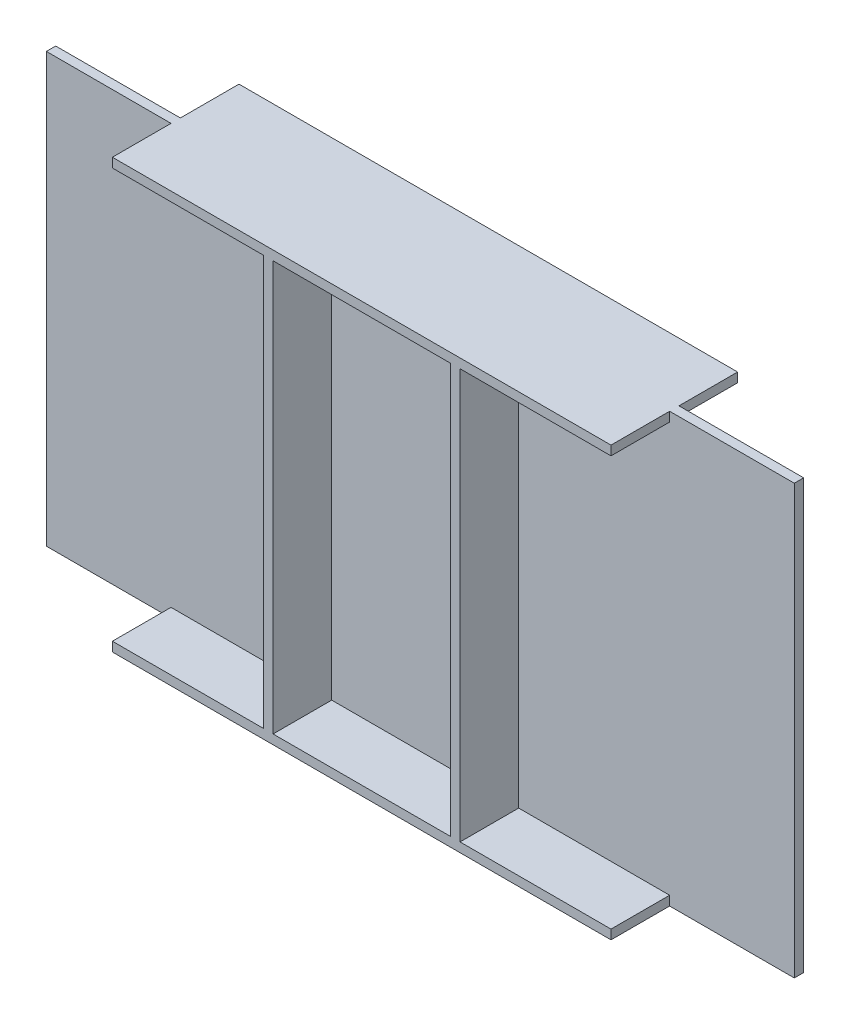
ISO-10303-21;
HEADER;
FILE_DESCRIPTION(('STEP AP214'),'2;1');
FILE_NAME('part.step','',(''),(''),'','','');
FILE_SCHEMA(('AUTOMOTIVE_DESIGN { 1 0 10303 214 1 1 1 1 }'));
ENDSEC;
DATA;
#1=APPLICATION_CONTEXT('core data for automotive mechanical design processes');
#2=APPLICATION_PROTOCOL_DEFINITION('international standard','automotive_design',2000,#1);
#3=PRODUCT_CONTEXT('',#1,'mechanical');
#4=PRODUCT('Part','Part','',(#3));
#5=PRODUCT_RELATED_PRODUCT_CATEGORY('part','',(#4));
#6=PRODUCT_DEFINITION_FORMATION('','',#4);
#7=PRODUCT_DEFINITION_CONTEXT('part definition',#1,'design');
#8=PRODUCT_DEFINITION('design','',#6,#7);
#9=PRODUCT_DEFINITION_SHAPE('','',#8);
#10=(LENGTH_UNIT() NAMED_UNIT(*) SI_UNIT(.MILLI.,.METRE.));
#11=(NAMED_UNIT(*) PLANE_ANGLE_UNIT() SI_UNIT($,.RADIAN.));
#12=(NAMED_UNIT(*) SI_UNIT($,.STERADIAN.) SOLID_ANGLE_UNIT());
#13=UNCERTAINTY_MEASURE_WITH_UNIT(LENGTH_MEASURE(1.E-05),#10,'distance_accuracy_value','');
#14=(GEOMETRIC_REPRESENTATION_CONTEXT(3) GLOBAL_UNCERTAINTY_ASSIGNED_CONTEXT((#13)) GLOBAL_UNIT_ASSIGNED_CONTEXT((#10,
#11,#12)) REPRESENTATION_CONTEXT('',''));
#15=CARTESIAN_POINT('',(0.,0.,0.));
#16=DIRECTION('',(0.,0.,1.));
#17=DIRECTION('',(1.,0.,0.));
#18=AXIS2_PLACEMENT_3D('',#15,#16,#17);
#19=CARTESIAN_POINT('',(0.,0.,12.));
#20=DIRECTION('',(0.,0.,-1.));
#21=DIRECTION('',(-1.,0.,0.));
#22=AXIS2_PLACEMENT_3D('',#19,#20,#21);
#23=PLANE('',#22);
#24=DIRECTION('',(1.,0.,0.));
#25=VECTOR('',#24,1.);
#26=CARTESIAN_POINT('',(0.,538.,12.));
#27=LINE('',#26,#25);
#28=CARTESIAN_POINT('',(366.25,538.,12.));
#29=VERTEX_POINT('',#28);
#30=CARTESIAN_POINT('',(593.75,538.,12.));
#31=VERTEX_POINT('',#30);
#32=EDGE_CURVE('E378',#29,#31,#27,.T.);
#33=ORIENTED_EDGE('',*,*,#32,.F.);
#34=DIRECTION('',(0.,-1.,0.));
#35=VECTOR('',#34,1.);
#36=CARTESIAN_POINT('',(366.25,0.,12.));
#37=LINE('',#36,#35);
#38=CARTESIAN_POINT('',(366.25,12.,12.));
#39=VERTEX_POINT('',#38);
#40=EDGE_CURVE('E545',#29,#39,#37,.T.);
#41=ORIENTED_EDGE('',*,*,#40,.T.);
#42=DIRECTION('',(-1.,0.,0.));
#43=VECTOR('',#42,1.);
#44=CARTESIAN_POINT('',(0.,12.,12.));
#45=LINE('',#44,#43);
#46=CARTESIAN_POINT('',(593.75,12.,12.));
#47=VERTEX_POINT('',#46);
#48=EDGE_CURVE('E283',#47,#39,#45,.T.);
#49=ORIENTED_EDGE('',*,*,#48,.F.);
#50=DIRECTION('',(0.,1.,0.));
#51=VECTOR('',#50,1.);
#52=CARTESIAN_POINT('',(593.75,-1.25322228302507E-13,12.));
#53=LINE('',#52,#51);
#54=EDGE_CURVE('E519',#47,#31,#53,.T.);
#55=ORIENTED_EDGE('',*,*,#54,.T.);
#56=EDGE_LOOP('',(#33,#41,#49,#55));
#57=FACE_BOUND('',#56,.T.);
#58=ADVANCED_FACE('F32',(#57),#23,.F.);
#59=CARTESIAN_POINT('',(0.,0.,0.));
#60=DIRECTION('',(0.,0.,-1.));
#61=DIRECTION('',(-1.,0.,0.));
#62=AXIS2_PLACEMENT_3D('',#59,#60,#61);
#63=PLANE('',#62);
#64=DIRECTION('',(0.,-1.,0.));
#65=VECTOR('',#64,1.);
#66=CARTESIAN_POINT('',(366.25,0.,0.));
#67=LINE('',#66,#65);
#68=CARTESIAN_POINT('',(366.25,538.,0.));
#69=VERTEX_POINT('',#68);
#70=CARTESIAN_POINT('',(366.25,12.,0.));
#71=VERTEX_POINT('',#70);
#72=EDGE_CURVE('E549',#69,#71,#67,.T.);
#73=ORIENTED_EDGE('',*,*,#72,.F.);
#74=DIRECTION('',(1.,0.,0.));
#75=VECTOR('',#74,1.);
#76=CARTESIAN_POINT('',(0.,538.,0.));
#77=LINE('',#76,#75);
#78=CARTESIAN_POINT('',(593.75,538.,0.));
#79=VERTEX_POINT('',#78);
#80=EDGE_CURVE('E425',#69,#79,#77,.T.);
#81=ORIENTED_EDGE('',*,*,#80,.T.);
#82=DIRECTION('',(0.,1.,0.));
#83=VECTOR('',#82,1.);
#84=CARTESIAN_POINT('',(593.75,-1.25322228302507E-13,0.));
#85=LINE('',#84,#83);
#86=CARTESIAN_POINT('',(593.75,12.,0.));
#87=VERTEX_POINT('',#86);
#88=EDGE_CURVE('E522',#87,#79,#85,.T.);
#89=ORIENTED_EDGE('',*,*,#88,.F.);
#90=DIRECTION('',(-1.,0.,0.));
#91=VECTOR('',#90,1.);
#92=CARTESIAN_POINT('',(0.,12.,0.));
#93=LINE('',#92,#91);
#94=EDGE_CURVE('E434',#87,#71,#93,.T.);
#95=ORIENTED_EDGE('',*,*,#94,.T.);
#96=EDGE_LOOP('',(#73,#81,#89,#95));
#97=FACE_BOUND('',#96,.T.);
#98=ADVANCED_FACE('F603',(#97),#63,.T.);
#99=CARTESIAN_POINT('',(0.,538.,0.));
#100=DIRECTION('',(0.,1.,0.));
#101=DIRECTION('',(0.,0.,1.));
#102=AXIS2_PLACEMENT_3D('',#99,#100,#101);
#103=PLANE('',#102);
#104=ORIENTED_EDGE('',*,*,#80,.F.);
#105=DIRECTION('',(0.,0.,-1.));
#106=VECTOR('',#105,1.);
#107=CARTESIAN_POINT('',(366.25,538.,87.25));
#108=LINE('',#107,#106);
#109=CARTESIAN_POINT('',(366.25,538.,-75.25));
#110=VERTEX_POINT('',#109);
#111=EDGE_CURVE('E562',#69,#110,#108,.T.);
#112=ORIENTED_EDGE('',*,*,#111,.T.);
#113=DIRECTION('',(-1.,0.,0.));
#114=VECTOR('',#113,1.);
#115=CARTESIAN_POINT('',(160.,538.,-75.25));
#116=LINE('',#115,#114);
#117=CARTESIAN_POINT('',(593.75,538.,-75.25));
#118=VERTEX_POINT('',#117);
#119=EDGE_CURVE('E351',#118,#110,#116,.T.);
#120=ORIENTED_EDGE('',*,*,#119,.F.);
#121=DIRECTION('',(0.,0.,-1.));
#122=VECTOR('',#121,1.);
#123=CARTESIAN_POINT('',(593.75,538.,87.25));
#124=LINE('',#123,#122);
#125=EDGE_CURVE('E532',#79,#118,#124,.T.);
#126=ORIENTED_EDGE('',*,*,#125,.F.);
#127=EDGE_LOOP('',(#104,#112,#120,#126));
#128=FACE_BOUND('',#127,.T.);
#129=ADVANCED_FACE('F587',(#128),#103,.F.);
#130=DIRECTION('',(1.,0.,0.));
#131=VECTOR('',#130,1.);
#132=CARTESIAN_POINT('',(160.,538.,87.25));
#133=LINE('',#132,#131);
#134=CARTESIAN_POINT('',(366.25,538.,87.25));
#135=VERTEX_POINT('',#134);
#136=CARTESIAN_POINT('',(593.75,538.,87.25));
#137=VERTEX_POINT('',#136);
#138=EDGE_CURVE('E342',#135,#137,#133,.T.);
#139=ORIENTED_EDGE('',*,*,#138,.F.);
#140=EDGE_CURVE('E270',#135,#29,#108,.T.);
#141=ORIENTED_EDGE('',*,*,#140,.T.);
#142=ORIENTED_EDGE('',*,*,#32,.T.);
#143=EDGE_CURVE('E533',#137,#31,#124,.T.);
#144=ORIENTED_EDGE('',*,*,#143,.F.);
#145=EDGE_LOOP('',(#139,#141,#142,#144));
#146=FACE_BOUND('',#145,.T.);
#147=ADVANCED_FACE('F626',(#146),#103,.F.);
#148=CARTESIAN_POINT('',(0.,12.,0.));
#149=DIRECTION('',(0.,-1.,0.));
#150=DIRECTION('',(0.,0.,-1.));
#151=AXIS2_PLACEMENT_3D('',#148,#149,#150);
#152=PLANE('',#151);
#153=DIRECTION('',(1.,0.,0.));
#154=VECTOR('',#153,1.);
#155=CARTESIAN_POINT('',(160.,12.,-75.25));
#156=LINE('',#155,#154);
#157=CARTESIAN_POINT('',(366.25,12.,-75.25));
#158=VERTEX_POINT('',#157);
#159=CARTESIAN_POINT('',(593.75,12.,-75.25));
#160=VERTEX_POINT('',#159);
#161=EDGE_CURVE('E510',#158,#160,#156,.T.);
#162=ORIENTED_EDGE('',*,*,#161,.F.);
#163=DIRECTION('',(0.,0.,-1.));
#164=VECTOR('',#163,1.);
#165=CARTESIAN_POINT('',(366.25,12.,87.25));
#166=LINE('',#165,#164);
#167=EDGE_CURVE('E285',#71,#158,#166,.T.);
#168=ORIENTED_EDGE('',*,*,#167,.F.);
#169=ORIENTED_EDGE('',*,*,#94,.F.);
#170=DIRECTION('',(0.,0.,-1.));
#171=VECTOR('',#170,1.);
#172=CARTESIAN_POINT('',(593.75,12.,87.25));
#173=LINE('',#172,#171);
#174=EDGE_CURVE('E528',#87,#160,#173,.T.);
#175=ORIENTED_EDGE('',*,*,#174,.T.);
#176=EDGE_LOOP('',(#162,#168,#169,#175));
#177=FACE_BOUND('',#176,.T.);
#178=ADVANCED_FACE('F578',(#177),#152,.F.);
#179=ORIENTED_EDGE('',*,*,#48,.T.);
#180=CARTESIAN_POINT('',(366.25,12.,87.25));
#181=VERTEX_POINT('',#180);
#182=EDGE_CURVE('E267',#181,#39,#166,.T.);
#183=ORIENTED_EDGE('',*,*,#182,.F.);
#184=DIRECTION('',(-1.,0.,0.));
#185=VECTOR('',#184,1.);
#186=CARTESIAN_POINT('',(160.,12.,87.25));
#187=LINE('',#186,#185);
#188=CARTESIAN_POINT('',(593.75,12.,87.25));
#189=VERTEX_POINT('',#188);
#190=EDGE_CURVE('E281',#189,#181,#187,.T.);
#191=ORIENTED_EDGE('',*,*,#190,.F.);
#192=EDGE_CURVE('E530',#189,#47,#173,.T.);
#193=ORIENTED_EDGE('',*,*,#192,.T.);
#194=EDGE_LOOP('',(#179,#183,#191,#193));
#195=FACE_BOUND('',#194,.T.);
#196=ADVANCED_FACE('F279',(#195),#152,.F.);
#197=CARTESIAN_POINT('',(606.25,538.,12.));
#198=VERTEX_POINT('',#197);
#199=CARTESIAN_POINT('',(800.,538.,12.));
#200=VERTEX_POINT('',#199);
#201=EDGE_CURVE('E366',#198,#200,#27,.T.);
#202=ORIENTED_EDGE('',*,*,#201,.F.);
#203=DIRECTION('',(0.,-1.,0.));
#204=VECTOR('',#203,1.);
#205=CARTESIAN_POINT('',(606.25,1.27960591003612E-13,12.));
#206=LINE('',#205,#204);
#207=CARTESIAN_POINT('',(606.25,12.,12.));
#208=VERTEX_POINT('',#207);
#209=EDGE_CURVE('E495',#198,#208,#206,.T.);
#210=ORIENTED_EDGE('',*,*,#209,.T.);
#211=CARTESIAN_POINT('',(800.,12.,12.));
#212=VERTEX_POINT('',#211);
#213=EDGE_CURVE('E324',#212,#208,#45,.T.);
#214=ORIENTED_EDGE('',*,*,#213,.F.);
#215=DIRECTION('',(0.,-1.,0.));
#216=VECTOR('',#215,1.);
#217=CARTESIAN_POINT('',(800.,0.,12.));
#218=LINE('',#217,#216);
#219=CARTESIAN_POINT('',(800.,0.,12.));
#220=VERTEX_POINT('',#219);
#221=EDGE_CURVE('E327',#212,#220,#218,.T.);
#222=ORIENTED_EDGE('',*,*,#221,.T.);
#223=DIRECTION('',(1.,0.,0.));
#224=VECTOR('',#223,1.);
#225=CARTESIAN_POINT('',(0.,0.,12.));
#226=LINE('',#225,#224);
#227=CARTESIAN_POINT('',(960.,0.,12.));
#228=VERTEX_POINT('',#227);
#229=EDGE_CURVE('E388',#220,#228,#226,.T.);
#230=ORIENTED_EDGE('',*,*,#229,.T.);
#231=DIRECTION('',(0.,1.,0.));
#232=VECTOR('',#231,1.);
#233=CARTESIAN_POINT('',(960.,0.,12.));
#234=LINE('',#233,#232);
#235=CARTESIAN_POINT('',(960.,550.,12.));
#236=VERTEX_POINT('',#235);
#237=EDGE_CURVE('E392',#228,#236,#234,.T.);
#238=ORIENTED_EDGE('',*,*,#237,.T.);
#239=DIRECTION('',(-1.,0.,0.));
#240=VECTOR('',#239,1.);
#241=CARTESIAN_POINT('',(0.,550.,12.));
#242=LINE('',#241,#240);
#243=CARTESIAN_POINT('',(800.,550.,12.));
#244=VERTEX_POINT('',#243);
#245=EDGE_CURVE('E395',#236,#244,#242,.T.);
#246=ORIENTED_EDGE('',*,*,#245,.T.);
#247=DIRECTION('',(0.,-1.,0.));
#248=VECTOR('',#247,1.);
#249=CARTESIAN_POINT('',(800.,0.,12.));
#250=LINE('',#249,#248);
#251=EDGE_CURVE('E377',#244,#200,#250,.T.);
#252=ORIENTED_EDGE('',*,*,#251,.T.);
#253=EDGE_LOOP('',(#202,#210,#214,#222,#230,#238,#246,#252));
#254=FACE_BOUND('',#253,.T.);
#255=ADVANCED_FACE('F459',(#254),#23,.F.);
#256=DIRECTION('',(0.,-1.,0.));
#257=VECTOR('',#256,1.);
#258=CARTESIAN_POINT('',(606.25,1.27960591003612E-13,0.));
#259=LINE('',#258,#257);
#260=CARTESIAN_POINT('',(606.25,538.,0.));
#261=VERTEX_POINT('',#260);
#262=CARTESIAN_POINT('',(606.25,12.,0.));
#263=VERTEX_POINT('',#262);
#264=EDGE_CURVE('E517',#261,#263,#259,.T.);
#265=ORIENTED_EDGE('',*,*,#264,.F.);
#266=CARTESIAN_POINT('',(800.,538.,0.));
#267=VERTEX_POINT('',#266);
#268=EDGE_CURVE('E420',#261,#267,#77,.T.);
#269=ORIENTED_EDGE('',*,*,#268,.T.);
#270=DIRECTION('',(0.,-1.,0.));
#271=VECTOR('',#270,1.);
#272=CARTESIAN_POINT('',(800.,0.,0.));
#273=LINE('',#272,#271);
#274=CARTESIAN_POINT('',(800.,550.,0.));
#275=VERTEX_POINT('',#274);
#276=EDGE_CURVE('E424',#275,#267,#273,.T.);
#277=ORIENTED_EDGE('',*,*,#276,.F.);
#278=DIRECTION('',(-1.,0.,0.));
#279=VECTOR('',#278,1.);
#280=CARTESIAN_POINT('',(0.,550.,0.));
#281=LINE('',#280,#279);
#282=CARTESIAN_POINT('',(960.,550.,0.));
#283=VERTEX_POINT('',#282);
#284=EDGE_CURVE('E389',#283,#275,#281,.T.);
#285=ORIENTED_EDGE('',*,*,#284,.F.);
#286=DIRECTION('',(0.,1.,0.));
#287=VECTOR('',#286,1.);
#288=CARTESIAN_POINT('',(960.,0.,0.));
#289=LINE('',#288,#287);
#290=CARTESIAN_POINT('',(960.,0.,0.));
#291=VERTEX_POINT('',#290);
#292=EDGE_CURVE('E404',#291,#283,#289,.T.);
#293=ORIENTED_EDGE('',*,*,#292,.F.);
#294=DIRECTION('',(1.,0.,0.));
#295=VECTOR('',#294,1.);
#296=CARTESIAN_POINT('',(0.,0.,0.));
#297=LINE('',#296,#295);
#298=CARTESIAN_POINT('',(800.,0.,0.));
#299=VERTEX_POINT('',#298);
#300=EDGE_CURVE('E400',#299,#291,#297,.T.);
#301=ORIENTED_EDGE('',*,*,#300,.F.);
#302=DIRECTION('',(0.,-1.,0.));
#303=VECTOR('',#302,1.);
#304=CARTESIAN_POINT('',(800.,0.,0.));
#305=LINE('',#304,#303);
#306=CARTESIAN_POINT('',(800.,12.,0.));
#307=VERTEX_POINT('',#306);
#308=EDGE_CURVE('E40',#307,#299,#305,.T.);
#309=ORIENTED_EDGE('',*,*,#308,.F.);
#310=EDGE_CURVE('E432',#307,#263,#93,.T.);
#311=ORIENTED_EDGE('',*,*,#310,.T.);
#312=EDGE_LOOP('',(#265,#269,#277,#285,#293,#301,#309,#311));
#313=FACE_BOUND('',#312,.T.);
#314=ADVANCED_FACE('F447',(#313),#63,.T.);
#315=ORIENTED_EDGE('',*,*,#268,.F.);
#316=DIRECTION('',(0.,0.,-1.));
#317=VECTOR('',#316,1.);
#318=CARTESIAN_POINT('',(606.25,538.,87.25));
#319=LINE('',#318,#317);
#320=CARTESIAN_POINT('',(606.25,538.,-75.25));
#321=VERTEX_POINT('',#320);
#322=EDGE_CURVE('E536',#261,#321,#319,.T.);
#323=ORIENTED_EDGE('',*,*,#322,.T.);
#324=CARTESIAN_POINT('',(800.,538.,-75.25));
#325=VERTEX_POINT('',#324);
#326=EDGE_CURVE('E347',#325,#321,#116,.T.);
#327=ORIENTED_EDGE('',*,*,#326,.F.);
#328=DIRECTION('',(0.,0.,-1.));
#329=VECTOR('',#328,1.);
#330=CARTESIAN_POINT('',(800.,538.,-75.25));
#331=LINE('',#330,#329);
#332=EDGE_CURVE('E341',#267,#325,#331,.T.);
#333=ORIENTED_EDGE('',*,*,#332,.F.);
#334=EDGE_LOOP('',(#315,#323,#327,#333));
#335=FACE_BOUND('',#334,.T.);
#336=ADVANCED_FACE('F613',(#335),#103,.F.);
#337=CARTESIAN_POINT('',(606.25,538.,87.25));
#338=VERTEX_POINT('',#337);
#339=CARTESIAN_POINT('',(800.,538.,87.25));
#340=VERTEX_POINT('',#339);
#341=EDGE_CURVE('E337',#338,#340,#133,.T.);
#342=ORIENTED_EDGE('',*,*,#341,.F.);
#343=EDGE_CURVE('E525',#338,#198,#319,.T.);
#344=ORIENTED_EDGE('',*,*,#343,.T.);
#345=ORIENTED_EDGE('',*,*,#201,.T.);
#346=EDGE_CURVE('E343',#340,#200,#331,.T.);
#347=ORIENTED_EDGE('',*,*,#346,.F.);
#348=EDGE_LOOP('',(#342,#344,#345,#347));
#349=FACE_BOUND('',#348,.T.);
#350=ADVANCED_FACE('F643',(#349),#103,.F.);
#351=CARTESIAN_POINT('',(606.25,12.,-75.25));
#352=VERTEX_POINT('',#351);
#353=CARTESIAN_POINT('',(800.,12.,-75.25));
#354=VERTEX_POINT('',#353);
#355=EDGE_CURVE('E505',#352,#354,#156,.T.);
#356=ORIENTED_EDGE('',*,*,#355,.F.);
#357=DIRECTION('',(0.,0.,-1.));
#358=VECTOR('',#357,1.);
#359=CARTESIAN_POINT('',(606.25,12.,87.25));
#360=LINE('',#359,#358);
#361=EDGE_CURVE('E529',#263,#352,#360,.T.);
#362=ORIENTED_EDGE('',*,*,#361,.F.);
#363=ORIENTED_EDGE('',*,*,#310,.F.);
#364=DIRECTION('',(0.,0.,1.));
#365=VECTOR('',#364,1.);
#366=CARTESIAN_POINT('',(800.,12.,87.25));
#367=LINE('',#366,#365);
#368=EDGE_CURVE('E296',#354,#307,#367,.T.);
#369=ORIENTED_EDGE('',*,*,#368,.F.);
#370=EDGE_LOOP('',(#356,#362,#363,#369));
#371=FACE_BOUND('',#370,.T.);
#372=ADVANCED_FACE('F507',(#371),#152,.F.);
#373=ORIENTED_EDGE('',*,*,#213,.T.);
#374=CARTESIAN_POINT('',(606.25,12.,87.25));
#375=VERTEX_POINT('',#374);
#376=EDGE_CURVE('E526',#375,#208,#360,.T.);
#377=ORIENTED_EDGE('',*,*,#376,.F.);
#378=CARTESIAN_POINT('',(800.,12.,87.25));
#379=VERTEX_POINT('',#378);
#380=EDGE_CURVE('E291',#379,#375,#187,.T.);
#381=ORIENTED_EDGE('',*,*,#380,.F.);
#382=EDGE_CURVE('E468',#212,#379,#367,.T.);
#383=ORIENTED_EDGE('',*,*,#382,.F.);
#384=EDGE_LOOP('',(#373,#377,#381,#383));
#385=FACE_BOUND('',#384,.T.);
#386=ADVANCED_FACE('F648',(#385),#152,.F.);
#387=CARTESIAN_POINT('',(0.,0.,12.));
#388=DIRECTION('',(1.,0.,0.));
#389=DIRECTION('',(0.,0.,-1.));
#390=AXIS2_PLACEMENT_3D('',#387,#388,#389);
#391=PLANE('',#390);
#392=DIRECTION('',(0.,-1.,0.));
#393=VECTOR('',#392,1.);
#394=CARTESIAN_POINT('',(0.,0.,0.));
#395=LINE('',#394,#393);
#396=CARTESIAN_POINT('',(0.,550.,0.));
#397=VERTEX_POINT('',#396);
#398=CARTESIAN_POINT('',(0.,0.,0.));
#399=VERTEX_POINT('',#398);
#400=EDGE_CURVE('E384',#397,#399,#395,.T.);
#401=ORIENTED_EDGE('',*,*,#400,.T.);
#402=DIRECTION('',(0.,0.,-1.));
#403=VECTOR('',#402,1.);
#404=CARTESIAN_POINT('',(0.,0.,12.));
#405=LINE('',#404,#403);
#406=CARTESIAN_POINT('',(0.,0.,12.));
#407=VERTEX_POINT('',#406);
#408=EDGE_CURVE('E417',#407,#399,#405,.T.);
#409=ORIENTED_EDGE('',*,*,#408,.F.);
#410=DIRECTION('',(0.,-1.,0.));
#411=VECTOR('',#410,1.);
#412=CARTESIAN_POINT('',(0.,0.,12.));
#413=LINE('',#412,#411);
#414=CARTESIAN_POINT('',(0.,550.,12.));
#415=VERTEX_POINT('',#414);
#416=EDGE_CURVE('E385',#415,#407,#413,.T.);
#417=ORIENTED_EDGE('',*,*,#416,.F.);
#418=DIRECTION('',(0.,0.,-1.));
#419=VECTOR('',#418,1.);
#420=CARTESIAN_POINT('',(0.,550.,12.));
#421=LINE('',#420,#419);
#422=EDGE_CURVE('E397',#415,#397,#421,.T.);
#423=ORIENTED_EDGE('',*,*,#422,.T.);
#424=EDGE_LOOP('',(#401,#409,#417,#423));
#425=FACE_BOUND('',#424,.T.);
#426=ADVANCED_FACE('F34',(#425),#391,.F.);
#427=CARTESIAN_POINT('',(0.,0.,12.));
#428=DIRECTION('',(0.,1.,0.));
#429=DIRECTION('',(0.,0.,1.));
#430=AXIS2_PLACEMENT_3D('',#427,#428,#429);
#431=PLANE('',#430);
#432=ORIENTED_EDGE('',*,*,#229,.F.);
#433=DIRECTION('',(0.,0.,1.));
#434=VECTOR('',#433,1.);
#435=CARTESIAN_POINT('',(800.,0.,87.25));
#436=LINE('',#435,#434);
#437=CARTESIAN_POINT('',(800.,0.,87.25));
#438=VERTEX_POINT('',#437);
#439=EDGE_CURVE('E307',#220,#438,#436,.T.);
#440=ORIENTED_EDGE('',*,*,#439,.T.);
#441=DIRECTION('',(-1.,0.,0.));
#442=VECTOR('',#441,1.);
#443=CARTESIAN_POINT('',(160.,0.,87.25));
#444=LINE('',#443,#442);
#445=CARTESIAN_POINT('',(160.,0.,87.25));
#446=VERTEX_POINT('',#445);
#447=EDGE_CURVE('E310',#438,#446,#444,.T.);
#448=ORIENTED_EDGE('',*,*,#447,.T.);
#449=DIRECTION('',(0.,0.,-1.));
#450=VECTOR('',#449,1.);
#451=CARTESIAN_POINT('',(160.,0.,87.25));
#452=LINE('',#451,#450);
#453=CARTESIAN_POINT('',(160.,0.,12.));
#454=VERTEX_POINT('',#453);
#455=EDGE_CURVE('E300',#446,#454,#452,.T.);
#456=ORIENTED_EDGE('',*,*,#455,.T.);
#457=EDGE_CURVE('E390',#407,#454,#226,.T.);
#458=ORIENTED_EDGE('',*,*,#457,.F.);
#459=ORIENTED_EDGE('',*,*,#408,.T.);
#460=CARTESIAN_POINT('',(160.,0.,0.));
#461=VERTEX_POINT('',#460);
#462=EDGE_CURVE('E401',#399,#461,#297,.T.);
#463=ORIENTED_EDGE('',*,*,#462,.T.);
#464=CARTESIAN_POINT('',(160.,0.,-75.25));
#465=VERTEX_POINT('',#464);
#466=EDGE_CURVE('E304',#461,#465,#452,.T.);
#467=ORIENTED_EDGE('',*,*,#466,.T.);
#468=DIRECTION('',(1.,0.,0.));
#469=VECTOR('',#468,1.);
#470=CARTESIAN_POINT('',(160.,0.,-75.25));
#471=LINE('',#470,#469);
#472=CARTESIAN_POINT('',(800.,0.,-75.25));
#473=VERTEX_POINT('',#472);
#474=EDGE_CURVE('E303',#465,#473,#471,.T.);
#475=ORIENTED_EDGE('',*,*,#474,.T.);
#476=EDGE_CURVE('E308',#473,#299,#436,.T.);
#477=ORIENTED_EDGE('',*,*,#476,.T.);
#478=ORIENTED_EDGE('',*,*,#300,.T.);
#479=DIRECTION('',(0.,0.,-1.));
#480=VECTOR('',#479,1.);
#481=CARTESIAN_POINT('',(960.,0.,12.));
#482=LINE('',#481,#480);
#483=EDGE_CURVE('E414',#228,#291,#482,.T.);
#484=ORIENTED_EDGE('',*,*,#483,.F.);
#485=EDGE_LOOP('',(#432,#440,#448,#456,#458,#459,#463,#467,#475,#477,#478,#484));
#486=FACE_BOUND('',#485,.T.);
#487=ADVANCED_FACE('F451',(#486),#431,.F.);
#488=CARTESIAN_POINT('',(960.,0.,12.));
#489=DIRECTION('',(-1.,0.,0.));
#490=DIRECTION('',(0.,0.,1.));
#491=AXIS2_PLACEMENT_3D('',#488,#489,#490);
#492=PLANE('',#491);
#493=ORIENTED_EDGE('',*,*,#292,.T.);
#494=DIRECTION('',(0.,0.,-1.));
#495=VECTOR('',#494,1.);
#496=CARTESIAN_POINT('',(960.,550.,12.));
#497=LINE('',#496,#495);
#498=EDGE_CURVE('E411',#236,#283,#497,.T.);
#499=ORIENTED_EDGE('',*,*,#498,.F.);
#500=ORIENTED_EDGE('',*,*,#237,.F.);
#501=ORIENTED_EDGE('',*,*,#483,.T.);
#502=EDGE_LOOP('',(#493,#499,#500,#501));
#503=FACE_BOUND('',#502,.T.);
#504=ADVANCED_FACE('F454',(#503),#492,.F.);
#505=CARTESIAN_POINT('',(0.,550.,12.));
#506=DIRECTION('',(0.,-1.,0.));
#507=DIRECTION('',(0.,0.,-1.));
#508=AXIS2_PLACEMENT_3D('',#505,#506,#507);
#509=PLANE('',#508);
#510=ORIENTED_EDGE('',*,*,#284,.T.);
#511=DIRECTION('',(0.,0.,-1.));
#512=VECTOR('',#511,1.);
#513=CARTESIAN_POINT('',(800.,550.,-75.25));
#514=LINE('',#513,#512);
#515=CARTESIAN_POINT('',(800.,550.,-75.25));
#516=VERTEX_POINT('',#515);
#517=EDGE_CURVE('E357',#275,#516,#514,.T.);
#518=ORIENTED_EDGE('',*,*,#517,.T.);
#519=DIRECTION('',(-1.,0.,0.));
#520=VECTOR('',#519,1.);
#521=CARTESIAN_POINT('',(160.,550.,-75.25));
#522=LINE('',#521,#520);
#523=CARTESIAN_POINT('',(160.,550.,-75.25));
#524=VERTEX_POINT('',#523);
#525=EDGE_CURVE('E361',#516,#524,#522,.T.);
#526=ORIENTED_EDGE('',*,*,#525,.T.);
#527=DIRECTION('',(0.,0.,1.));
#528=VECTOR('',#527,1.);
#529=CARTESIAN_POINT('',(160.,550.,-75.25));
#530=LINE('',#529,#528);
#531=CARTESIAN_POINT('',(160.,550.,0.));
#532=VERTEX_POINT('',#531);
#533=EDGE_CURVE('E352',#524,#532,#530,.T.);
#534=ORIENTED_EDGE('',*,*,#533,.T.);
#535=EDGE_CURVE('E406',#532,#397,#281,.T.);
#536=ORIENTED_EDGE('',*,*,#535,.T.);
#537=ORIENTED_EDGE('',*,*,#422,.F.);
#538=CARTESIAN_POINT('',(160.,550.,12.));
#539=VERTEX_POINT('',#538);
#540=EDGE_CURVE('E394',#539,#415,#242,.T.);
#541=ORIENTED_EDGE('',*,*,#540,.F.);
#542=CARTESIAN_POINT('',(160.,550.,87.25));
#543=VERTEX_POINT('',#542);
#544=EDGE_CURVE('E333',#539,#543,#530,.T.);
#545=ORIENTED_EDGE('',*,*,#544,.T.);
#546=DIRECTION('',(1.,0.,0.));
#547=VECTOR('',#546,1.);
#548=CARTESIAN_POINT('',(160.,550.,87.25));
#549=LINE('',#548,#547);
#550=CARTESIAN_POINT('',(800.,550.,87.25));
#551=VERTEX_POINT('',#550);
#552=EDGE_CURVE('E354',#543,#551,#549,.T.);
#553=ORIENTED_EDGE('',*,*,#552,.T.);
#554=EDGE_CURVE('E358',#551,#244,#514,.T.);
#555=ORIENTED_EDGE('',*,*,#554,.T.);
#556=ORIENTED_EDGE('',*,*,#245,.F.);
#557=ORIENTED_EDGE('',*,*,#498,.T.);
#558=EDGE_LOOP('',(#510,#518,#526,#534,#536,#537,#541,#545,#553,#555,#556,#557));
#559=FACE_BOUND('',#558,.T.);
#560=ADVANCED_FACE('F616',(#559),#509,.F.);
#561=CARTESIAN_POINT('',(353.75,12.,12.));
#562=VERTEX_POINT('',#561);
#563=CARTESIAN_POINT('',(160.,12.,12.));
#564=VERTEX_POINT('',#563);
#565=EDGE_CURVE('E316',#562,#564,#45,.T.);
#566=ORIENTED_EDGE('',*,*,#565,.F.);
#567=DIRECTION('',(0.,1.,0.));
#568=VECTOR('',#567,1.);
#569=CARTESIAN_POINT('',(353.75,0.,12.));
#570=LINE('',#569,#568);
#571=CARTESIAN_POINT('',(353.75,538.,12.));
#572=VERTEX_POINT('',#571);
#573=EDGE_CURVE('E551',#562,#572,#570,.T.);
#574=ORIENTED_EDGE('',*,*,#573,.T.);
#575=CARTESIAN_POINT('',(160.,538.,12.));
#576=VERTEX_POINT('',#575);
#577=EDGE_CURVE('E374',#576,#572,#27,.T.);
#578=ORIENTED_EDGE('',*,*,#577,.F.);
#579=DIRECTION('',(0.,1.,0.));
#580=VECTOR('',#579,1.);
#581=CARTESIAN_POINT('',(160.,0.,12.));
#582=LINE('',#581,#580);
#583=EDGE_CURVE('E381',#576,#539,#582,.T.);
#584=ORIENTED_EDGE('',*,*,#583,.T.);
#585=ORIENTED_EDGE('',*,*,#540,.T.);
#586=ORIENTED_EDGE('',*,*,#416,.T.);
#587=ORIENTED_EDGE('',*,*,#457,.T.);
#588=DIRECTION('',(0.,1.,0.));
#589=VECTOR('',#588,1.);
#590=CARTESIAN_POINT('',(160.,0.,12.));
#591=LINE('',#590,#589);
#592=EDGE_CURVE('E330',#454,#564,#591,.T.);
#593=ORIENTED_EDGE('',*,*,#592,.T.);
#594=EDGE_LOOP('',(#566,#574,#578,#584,#585,#586,#587,#593));
#595=FACE_BOUND('',#594,.T.);
#596=ADVANCED_FACE('F483',(#595),#23,.F.);
#597=DIRECTION('',(0.,1.,0.));
#598=VECTOR('',#597,1.);
#599=CARTESIAN_POINT('',(353.75,0.,0.));
#600=LINE('',#599,#598);
#601=CARTESIAN_POINT('',(353.75,12.,0.));
#602=VERTEX_POINT('',#601);
#603=CARTESIAN_POINT('',(353.75,538.,0.));
#604=VERTEX_POINT('',#603);
#605=EDGE_CURVE('E554',#602,#604,#600,.T.);
#606=ORIENTED_EDGE('',*,*,#605,.F.);
#607=CARTESIAN_POINT('',(160.,12.,0.));
#608=VERTEX_POINT('',#607);
#609=EDGE_CURVE('E431',#602,#608,#93,.T.);
#610=ORIENTED_EDGE('',*,*,#609,.T.);
#611=DIRECTION('',(0.,1.,0.));
#612=VECTOR('',#611,1.);
#613=CARTESIAN_POINT('',(160.,0.,0.));
#614=LINE('',#613,#612);
#615=EDGE_CURVE('E11',#461,#608,#614,.T.);
#616=ORIENTED_EDGE('',*,*,#615,.F.);
#617=ORIENTED_EDGE('',*,*,#462,.F.);
#618=ORIENTED_EDGE('',*,*,#400,.F.);
#619=ORIENTED_EDGE('',*,*,#535,.F.);
#620=DIRECTION('',(0.,1.,0.));
#621=VECTOR('',#620,1.);
#622=CARTESIAN_POINT('',(160.,0.,0.));
#623=LINE('',#622,#621);
#624=CARTESIAN_POINT('',(160.,538.,0.));
#625=VERTEX_POINT('',#624);
#626=EDGE_CURVE('E428',#625,#532,#623,.T.);
#627=ORIENTED_EDGE('',*,*,#626,.F.);
#628=EDGE_CURVE('E421',#625,#604,#77,.T.);
#629=ORIENTED_EDGE('',*,*,#628,.T.);
#630=EDGE_LOOP('',(#606,#610,#616,#617,#618,#619,#627,#629));
#631=FACE_BOUND('',#630,.T.);
#632=ADVANCED_FACE('F490',(#631),#63,.T.);
#633=CARTESIAN_POINT('',(160.,538.,-75.25));
#634=DIRECTION('',(0.,0.,-1.));
#635=DIRECTION('',(-1.,0.,0.));
#636=AXIS2_PLACEMENT_3D('',#633,#634,#635);
#637=PLANE('',#636);
#638=ORIENTED_EDGE('',*,*,#119,.T.);
#639=DIRECTION('',(0.,-1.,0.));
#640=VECTOR('',#639,1.);
#641=CARTESIAN_POINT('',(366.25,538.,-75.25));
#642=LINE('',#641,#640);
#643=EDGE_CURVE('E47',#110,#158,#642,.T.);
#644=ORIENTED_EDGE('',*,*,#643,.T.);
#645=ORIENTED_EDGE('',*,*,#161,.T.);
#646=DIRECTION('',(0.,1.,0.));
#647=VECTOR('',#646,1.);
#648=CARTESIAN_POINT('',(593.75,538.,-75.25));
#649=LINE('',#648,#647);
#650=EDGE_CURVE('E539',#160,#118,#649,.T.);
#651=ORIENTED_EDGE('',*,*,#650,.T.);
#652=EDGE_LOOP('',(#638,#644,#645,#651));
#653=FACE_BOUND('',#652,.T.);
#654=ORIENTED_EDGE('',*,*,#525,.F.);
#655=DIRECTION('',(0.,1.,0.));
#656=VECTOR('',#655,1.);
#657=CARTESIAN_POINT('',(800.,538.,-75.25));
#658=LINE('',#657,#656);
#659=EDGE_CURVE('E367',#325,#516,#658,.T.);
#660=ORIENTED_EDGE('',*,*,#659,.F.);
#661=ORIENTED_EDGE('',*,*,#326,.T.);
#662=DIRECTION('',(0.,-1.,0.));
#663=VECTOR('',#662,1.);
#664=CARTESIAN_POINT('',(606.25,538.,-75.25));
#665=LINE('',#664,#663);
#666=EDGE_CURVE('E543',#321,#352,#665,.T.);
#667=ORIENTED_EDGE('',*,*,#666,.T.);
#668=ORIENTED_EDGE('',*,*,#355,.T.);
#669=DIRECTION('',(0.,-1.,0.));
#670=VECTOR('',#669,1.);
#671=CARTESIAN_POINT('',(800.,12.,-75.25));
#672=LINE('',#671,#670);
#673=EDGE_CURVE('E320',#354,#473,#672,.T.);
#674=ORIENTED_EDGE('',*,*,#673,.T.);
#675=ORIENTED_EDGE('',*,*,#474,.F.);
#676=DIRECTION('',(0.,-1.,0.));
#677=VECTOR('',#676,1.);
#678=CARTESIAN_POINT('',(160.,12.,-75.25));
#679=LINE('',#678,#677);
#680=CARTESIAN_POINT('',(160.,12.,-75.25));
#681=VERTEX_POINT('',#680);
#682=EDGE_CURVE('E295',#681,#465,#679,.T.);
#683=ORIENTED_EDGE('',*,*,#682,.F.);
#684=CARTESIAN_POINT('',(353.75,12.,-75.25));
#685=VERTEX_POINT('',#684);
#686=EDGE_CURVE('E509',#681,#685,#156,.T.);
#687=ORIENTED_EDGE('',*,*,#686,.T.);
#688=DIRECTION('',(0.,1.,0.));
#689=VECTOR('',#688,1.);
#690=CARTESIAN_POINT('',(353.75,538.,-75.25));
#691=LINE('',#690,#689);
#692=CARTESIAN_POINT('',(353.75,538.,-75.25));
#693=VERTEX_POINT('',#692);
#694=EDGE_CURVE('E274',#685,#693,#691,.T.);
#695=ORIENTED_EDGE('',*,*,#694,.T.);
#696=CARTESIAN_POINT('',(160.,538.,-75.25));
#697=VERTEX_POINT('',#696);
#698=EDGE_CURVE('E346',#693,#697,#116,.T.);
#699=ORIENTED_EDGE('',*,*,#698,.T.);
#700=DIRECTION('',(0.,1.,0.));
#701=VECTOR('',#700,1.);
#702=CARTESIAN_POINT('',(160.,538.,-75.25));
#703=LINE('',#702,#701);
#704=EDGE_CURVE('E364',#697,#524,#703,.T.);
#705=ORIENTED_EDGE('',*,*,#704,.T.);
#706=EDGE_LOOP('',(#654,#660,#661,#667,#668,#674,#675,#683,#687,#695,#699,#705));
#707=FACE_BOUND('',#706,.T.);
#708=ADVANCED_FACE('F503',(#653,#707),#637,.T.);
#709=ORIENTED_EDGE('',*,*,#698,.F.);
#710=DIRECTION('',(0.,0.,-1.));
#711=VECTOR('',#710,1.);
#712=CARTESIAN_POINT('',(353.75,538.,87.25));
#713=LINE('',#712,#711);
#714=EDGE_CURVE('E559',#604,#693,#713,.T.);
#715=ORIENTED_EDGE('',*,*,#714,.F.);
#716=ORIENTED_EDGE('',*,*,#628,.F.);
#717=DIRECTION('',(0.,0.,1.));
#718=VECTOR('',#717,1.);
#719=CARTESIAN_POINT('',(160.,538.,-75.25));
#720=LINE('',#719,#718);
#721=EDGE_CURVE('E334',#697,#625,#720,.T.);
#722=ORIENTED_EDGE('',*,*,#721,.F.);
#723=EDGE_LOOP('',(#709,#715,#716,#722));
#724=FACE_BOUND('',#723,.T.);
#725=ADVANCED_FACE('F596',(#724),#103,.F.);
#726=CARTESIAN_POINT('',(800.,538.,-75.25));
#727=DIRECTION('',(1.,0.,0.));
#728=DIRECTION('',(0.,0.,-1.));
#729=AXIS2_PLACEMENT_3D('',#726,#727,#728);
#730=PLANE('',#729);
#731=ORIENTED_EDGE('',*,*,#517,.F.);
#732=ORIENTED_EDGE('',*,*,#276,.T.);
#733=ORIENTED_EDGE('',*,*,#332,.T.);
#734=ORIENTED_EDGE('',*,*,#659,.T.);
#735=EDGE_LOOP('',(#731,#732,#733,#734));
#736=FACE_BOUND('',#735,.T.);
#737=ADVANCED_FACE('F610',(#736),#730,.T.);
#738=CARTESIAN_POINT('',(160.,538.,-75.25));
#739=DIRECTION('',(-1.,0.,0.));
#740=DIRECTION('',(0.,0.,1.));
#741=AXIS2_PLACEMENT_3D('',#738,#739,#740);
#742=PLANE('',#741);
#743=ORIENTED_EDGE('',*,*,#721,.T.);
#744=ORIENTED_EDGE('',*,*,#626,.T.);
#745=ORIENTED_EDGE('',*,*,#533,.F.);
#746=ORIENTED_EDGE('',*,*,#704,.F.);
#747=EDGE_LOOP('',(#743,#744,#745,#746));
#748=FACE_BOUND('',#747,.T.);
#749=ADVANCED_FACE('F595',(#748),#742,.T.);
#750=ORIENTED_EDGE('',*,*,#583,.F.);
#751=CARTESIAN_POINT('',(160.,538.,87.25));
#752=VERTEX_POINT('',#751);
#753=EDGE_CURVE('E338',#576,#752,#720,.T.);
#754=ORIENTED_EDGE('',*,*,#753,.T.);
#755=DIRECTION('',(0.,1.,0.));
#756=VECTOR('',#755,1.);
#757=CARTESIAN_POINT('',(160.,538.,87.25));
#758=LINE('',#757,#756);
#759=EDGE_CURVE('E350',#752,#543,#758,.T.);
#760=ORIENTED_EDGE('',*,*,#759,.T.);
#761=ORIENTED_EDGE('',*,*,#544,.F.);
#762=EDGE_LOOP('',(#750,#754,#760,#761));
#763=FACE_BOUND('',#762,.T.);
#764=ADVANCED_FACE('F639',(#763),#742,.T.);
#765=ORIENTED_EDGE('',*,*,#251,.F.);
#766=ORIENTED_EDGE('',*,*,#554,.F.);
#767=DIRECTION('',(0.,1.,0.));
#768=VECTOR('',#767,1.);
#769=CARTESIAN_POINT('',(800.,538.,87.25));
#770=LINE('',#769,#768);
#771=EDGE_CURVE('E370',#340,#551,#770,.T.);
#772=ORIENTED_EDGE('',*,*,#771,.F.);
#773=ORIENTED_EDGE('',*,*,#346,.T.);
#774=EDGE_LOOP('',(#765,#766,#772,#773));
#775=FACE_BOUND('',#774,.T.);
#776=ADVANCED_FACE('F620',(#775),#730,.T.);
#777=ORIENTED_EDGE('',*,*,#577,.T.);
#778=CARTESIAN_POINT('',(353.75,538.,87.25));
#779=VERTEX_POINT('',#778);
#780=EDGE_CURVE('E560',#779,#572,#713,.T.);
#781=ORIENTED_EDGE('',*,*,#780,.F.);
#782=EDGE_CURVE('E339',#752,#779,#133,.T.);
#783=ORIENTED_EDGE('',*,*,#782,.F.);
#784=ORIENTED_EDGE('',*,*,#753,.F.);
#785=EDGE_LOOP('',(#777,#781,#783,#784));
#786=FACE_BOUND('',#785,.T.);
#787=ADVANCED_FACE('F635',(#786),#103,.F.);
#788=CARTESIAN_POINT('',(160.,538.,87.25));
#789=DIRECTION('',(0.,0.,1.));
#790=DIRECTION('',(1.,0.,0.));
#791=AXIS2_PLACEMENT_3D('',#788,#789,#790);
#792=PLANE('',#791);
#793=DIRECTION('',(0.,-1.,0.));
#794=VECTOR('',#793,1.);
#795=CARTESIAN_POINT('',(366.25,538.,87.25));
#796=LINE('',#795,#794);
#797=EDGE_CURVE('E264',#135,#181,#796,.T.);
#798=ORIENTED_EDGE('',*,*,#797,.F.);
#799=ORIENTED_EDGE('',*,*,#138,.T.);
#800=DIRECTION('',(0.,1.,0.));
#801=VECTOR('',#800,1.);
#802=CARTESIAN_POINT('',(593.75,538.,87.25));
#803=LINE('',#802,#801);
#804=EDGE_CURVE('E289',#189,#137,#803,.T.);
#805=ORIENTED_EDGE('',*,*,#804,.F.);
#806=ORIENTED_EDGE('',*,*,#190,.T.);
#807=EDGE_LOOP('',(#798,#799,#805,#806));
#808=FACE_BOUND('',#807,.T.);
#809=ORIENTED_EDGE('',*,*,#552,.F.);
#810=ORIENTED_EDGE('',*,*,#759,.F.);
#811=ORIENTED_EDGE('',*,*,#782,.T.);
#812=DIRECTION('',(0.,1.,0.));
#813=VECTOR('',#812,1.);
#814=CARTESIAN_POINT('',(353.75,538.,87.25));
#815=LINE('',#814,#813);
#816=CARTESIAN_POINT('',(353.75,12.,87.25));
#817=VERTEX_POINT('',#816);
#818=EDGE_CURVE('E55',#817,#779,#815,.T.);
#819=ORIENTED_EDGE('',*,*,#818,.F.);
#820=CARTESIAN_POINT('',(160.,12.,87.25));
#821=VERTEX_POINT('',#820);
#822=EDGE_CURVE('E292',#817,#821,#187,.T.);
#823=ORIENTED_EDGE('',*,*,#822,.T.);
#824=DIRECTION('',(0.,-1.,0.));
#825=VECTOR('',#824,1.);
#826=CARTESIAN_POINT('',(160.,12.,87.25));
#827=LINE('',#826,#825);
#828=EDGE_CURVE('E314',#821,#446,#827,.T.);
#829=ORIENTED_EDGE('',*,*,#828,.T.);
#830=ORIENTED_EDGE('',*,*,#447,.F.);
#831=DIRECTION('',(0.,-1.,0.));
#832=VECTOR('',#831,1.);
#833=CARTESIAN_POINT('',(800.,12.,87.25));
#834=LINE('',#833,#832);
#835=EDGE_CURVE('E317',#379,#438,#834,.T.);
#836=ORIENTED_EDGE('',*,*,#835,.F.);
#837=ORIENTED_EDGE('',*,*,#380,.T.);
#838=DIRECTION('',(0.,-1.,0.));
#839=VECTOR('',#838,1.);
#840=CARTESIAN_POINT('',(606.25,538.,87.25));
#841=LINE('',#840,#839);
#842=EDGE_CURVE('E542',#338,#375,#841,.T.);
#843=ORIENTED_EDGE('',*,*,#842,.F.);
#844=ORIENTED_EDGE('',*,*,#341,.T.);
#845=ORIENTED_EDGE('',*,*,#771,.T.);
#846=EDGE_LOOP('',(#809,#810,#811,#819,#823,#829,#830,#836,#837,#843,#844,#845));
#847=FACE_BOUND('',#846,.T.);
#848=ADVANCED_FACE('F287',(#808,#847),#792,.T.);
#849=ORIENTED_EDGE('',*,*,#609,.F.);
#850=DIRECTION('',(0.,0.,-1.));
#851=VECTOR('',#850,1.);
#852=CARTESIAN_POINT('',(353.75,12.,87.25));
#853=LINE('',#852,#851);
#854=EDGE_CURVE('E284',#602,#685,#853,.T.);
#855=ORIENTED_EDGE('',*,*,#854,.T.);
#856=ORIENTED_EDGE('',*,*,#686,.F.);
#857=DIRECTION('',(0.,0.,-1.));
#858=VECTOR('',#857,1.);
#859=CARTESIAN_POINT('',(160.,12.,87.25));
#860=LINE('',#859,#858);
#861=EDGE_CURVE('E313',#608,#681,#860,.T.);
#862=ORIENTED_EDGE('',*,*,#861,.F.);
#863=EDGE_LOOP('',(#849,#855,#856,#862));
#864=FACE_BOUND('',#863,.T.);
#865=ADVANCED_FACE('F601',(#864),#152,.F.);
#866=CARTESIAN_POINT('',(800.,12.,87.25));
#867=DIRECTION('',(1.,0.,0.));
#868=DIRECTION('',(0.,0.,-1.));
#869=AXIS2_PLACEMENT_3D('',#866,#867,#868);
#870=PLANE('',#869);
#871=ORIENTED_EDGE('',*,*,#368,.T.);
#872=ORIENTED_EDGE('',*,*,#308,.T.);
#873=ORIENTED_EDGE('',*,*,#476,.F.);
#874=ORIENTED_EDGE('',*,*,#673,.F.);
#875=EDGE_LOOP('',(#871,#872,#873,#874));
#876=FACE_BOUND('',#875,.T.);
#877=ADVANCED_FACE('F441',(#876),#870,.T.);
#878=CARTESIAN_POINT('',(160.,12.,87.25));
#879=DIRECTION('',(-1.,0.,0.));
#880=DIRECTION('',(0.,0.,1.));
#881=AXIS2_PLACEMENT_3D('',#878,#879,#880);
#882=PLANE('',#881);
#883=ORIENTED_EDGE('',*,*,#466,.F.);
#884=ORIENTED_EDGE('',*,*,#615,.T.);
#885=ORIENTED_EDGE('',*,*,#861,.T.);
#886=ORIENTED_EDGE('',*,*,#682,.T.);
#887=EDGE_LOOP('',(#883,#884,#885,#886));
#888=FACE_BOUND('',#887,.T.);
#889=ADVANCED_FACE('F497',(#888),#882,.T.);
#890=ORIENTED_EDGE('',*,*,#592,.F.);
#891=ORIENTED_EDGE('',*,*,#455,.F.);
#892=ORIENTED_EDGE('',*,*,#828,.F.);
#893=EDGE_CURVE('E513',#821,#564,#860,.T.);
#894=ORIENTED_EDGE('',*,*,#893,.T.);
#895=EDGE_LOOP('',(#890,#891,#892,#894));
#896=FACE_BOUND('',#895,.T.);
#897=ADVANCED_FACE('F478',(#896),#882,.T.);
#898=ORIENTED_EDGE('',*,*,#221,.F.);
#899=ORIENTED_EDGE('',*,*,#382,.T.);
#900=ORIENTED_EDGE('',*,*,#835,.T.);
#901=ORIENTED_EDGE('',*,*,#439,.F.);
#902=EDGE_LOOP('',(#898,#899,#900,#901));
#903=FACE_BOUND('',#902,.T.);
#904=ADVANCED_FACE('F466',(#903),#870,.T.);
#905=ORIENTED_EDGE('',*,*,#822,.F.);
#906=EDGE_CURVE('E556',#817,#562,#853,.T.);
#907=ORIENTED_EDGE('',*,*,#906,.T.);
#908=ORIENTED_EDGE('',*,*,#565,.T.);
#909=ORIENTED_EDGE('',*,*,#893,.F.);
#910=EDGE_LOOP('',(#905,#907,#908,#909));
#911=FACE_BOUND('',#910,.T.);
#912=ADVANCED_FACE('F631',(#911),#152,.F.);
#913=CARTESIAN_POINT('',(593.75,538.,87.25));
#914=DIRECTION('',(-1.,0.,0.));
#915=DIRECTION('',(0.,-1.,0.));
#916=AXIS2_PLACEMENT_3D('',#913,#914,#915);
#917=PLANE('',#916);
#918=ORIENTED_EDGE('',*,*,#54,.F.);
#919=ORIENTED_EDGE('',*,*,#192,.F.);
#920=ORIENTED_EDGE('',*,*,#804,.T.);
#921=ORIENTED_EDGE('',*,*,#143,.T.);
#922=EDGE_LOOP('',(#918,#919,#920,#921));
#923=FACE_BOUND('',#922,.T.);
#924=ADVANCED_FACE('F629',(#923),#917,.T.);
#925=CARTESIAN_POINT('',(606.25,538.,87.25));
#926=DIRECTION('',(1.,0.,0.));
#927=DIRECTION('',(0.,1.,0.));
#928=AXIS2_PLACEMENT_3D('',#925,#926,#927);
#929=PLANE('',#928);
#930=ORIENTED_EDGE('',*,*,#209,.F.);
#931=ORIENTED_EDGE('',*,*,#343,.F.);
#932=ORIENTED_EDGE('',*,*,#842,.T.);
#933=ORIENTED_EDGE('',*,*,#376,.T.);
#934=EDGE_LOOP('',(#930,#931,#932,#933));
#935=FACE_BOUND('',#934,.T.);
#936=ADVANCED_FACE('F645',(#935),#929,.T.);
#937=ORIENTED_EDGE('',*,*,#322,.F.);
#938=ORIENTED_EDGE('',*,*,#264,.T.);
#939=ORIENTED_EDGE('',*,*,#361,.T.);
#940=ORIENTED_EDGE('',*,*,#666,.F.);
#941=EDGE_LOOP('',(#937,#938,#939,#940));
#942=FACE_BOUND('',#941,.T.);
#943=ADVANCED_FACE('F783',(#942),#929,.T.);
#944=ORIENTED_EDGE('',*,*,#174,.F.);
#945=ORIENTED_EDGE('',*,*,#88,.T.);
#946=ORIENTED_EDGE('',*,*,#125,.T.);
#947=ORIENTED_EDGE('',*,*,#650,.F.);
#948=EDGE_LOOP('',(#944,#945,#946,#947));
#949=FACE_BOUND('',#948,.T.);
#950=ADVANCED_FACE('F582',(#949),#917,.T.);
#951=CARTESIAN_POINT('',(353.75,538.,87.25));
#952=DIRECTION('',(-1.,0.,0.));
#953=DIRECTION('',(0.,-1.,0.));
#954=AXIS2_PLACEMENT_3D('',#951,#952,#953);
#955=PLANE('',#954);
#956=ORIENTED_EDGE('',*,*,#573,.F.);
#957=ORIENTED_EDGE('',*,*,#906,.F.);
#958=ORIENTED_EDGE('',*,*,#818,.T.);
#959=ORIENTED_EDGE('',*,*,#780,.T.);
#960=EDGE_LOOP('',(#956,#957,#958,#959));
#961=FACE_BOUND('',#960,.T.);
#962=ADVANCED_FACE('F795',(#961),#955,.T.);
#963=CARTESIAN_POINT('',(366.25,538.,87.25));
#964=DIRECTION('',(1.,0.,0.));
#965=DIRECTION('',(0.,1.,0.));
#966=AXIS2_PLACEMENT_3D('',#963,#964,#965);
#967=PLANE('',#966);
#968=ORIENTED_EDGE('',*,*,#40,.F.);
#969=ORIENTED_EDGE('',*,*,#140,.F.);
#970=ORIENTED_EDGE('',*,*,#797,.T.);
#971=ORIENTED_EDGE('',*,*,#182,.T.);
#972=EDGE_LOOP('',(#968,#969,#970,#971));
#973=FACE_BOUND('',#972,.T.);
#974=ADVANCED_FACE('F266',(#973),#967,.T.);
#975=ORIENTED_EDGE('',*,*,#111,.F.);
#976=ORIENTED_EDGE('',*,*,#72,.T.);
#977=ORIENTED_EDGE('',*,*,#167,.T.);
#978=ORIENTED_EDGE('',*,*,#643,.F.);
#979=EDGE_LOOP('',(#975,#976,#977,#978));
#980=FACE_BOUND('',#979,.T.);
#981=ADVANCED_FACE('F571',(#980),#967,.T.);
#982=ORIENTED_EDGE('',*,*,#854,.F.);
#983=ORIENTED_EDGE('',*,*,#605,.T.);
#984=ORIENTED_EDGE('',*,*,#714,.T.);
#985=ORIENTED_EDGE('',*,*,#694,.F.);
#986=EDGE_LOOP('',(#982,#983,#984,#985));
#987=FACE_BOUND('',#986,.T.);
#988=ADVANCED_FACE('F802',(#987),#955,.T.);
#989=CLOSED_SHELL('',(#58,#98,#129,#147,#178,#196,#255,#314,#336,#350,#372,#386,#426,#487,#504,
#560,#596,#632,#708,#725,#737,#749,#764,#776,#787,#848,#865,#877,#889,#897,#904,#912,#924,#936,
#943,#950,#962,#974,#981,#988));
#990=MANIFOLD_SOLID_BREP('B2',#989);
#991=ADVANCED_BREP_SHAPE_REPRESENTATION('',(#18,#990),#14);
#992=SHAPE_DEFINITION_REPRESENTATION(#9,#991);
ENDSEC;
END-ISO-10303-21;
